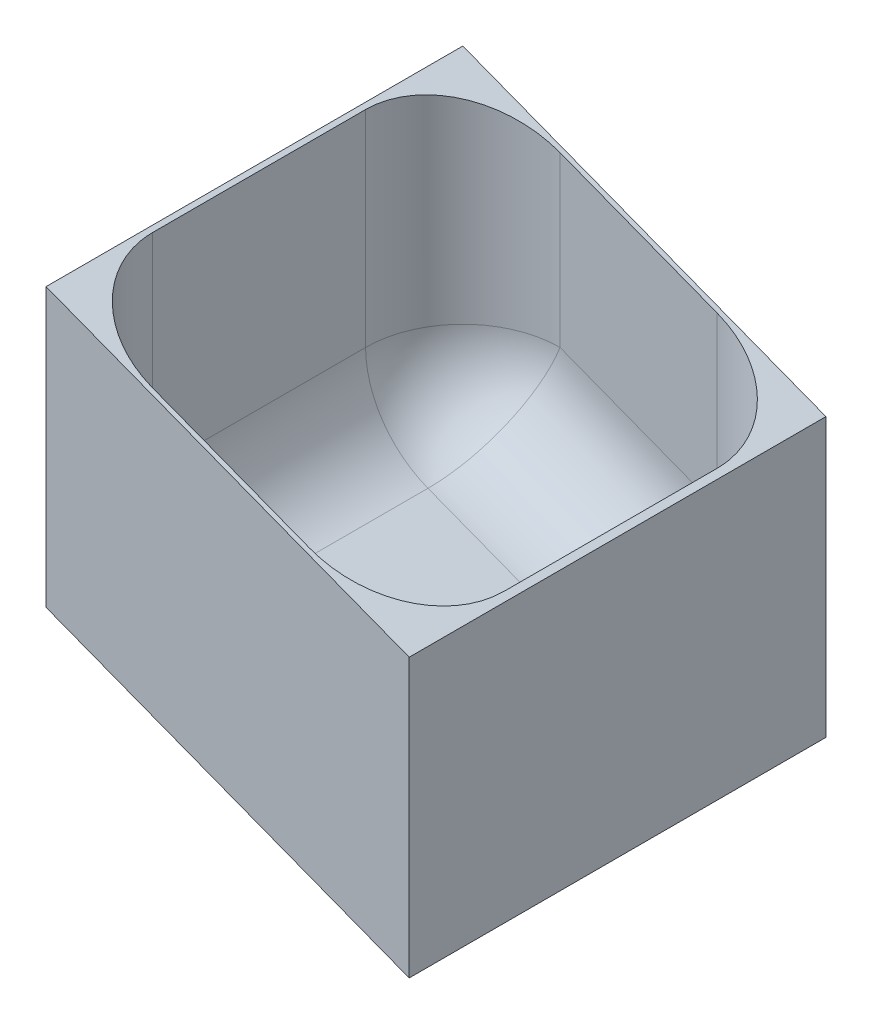
ISO-10303-21;
HEADER;
FILE_DESCRIPTION(('STEP AP214'),'2;1');
FILE_NAME('part.step','',(''),(''),'','','');
FILE_SCHEMA(('AUTOMOTIVE_DESIGN { 1 0 10303 214 1 1 1 1 }'));
ENDSEC;
DATA;
#1=APPLICATION_CONTEXT('core data for automotive mechanical design processes');
#2=APPLICATION_PROTOCOL_DEFINITION('international standard','automotive_design',2000,#1);
#3=PRODUCT_CONTEXT('',#1,'mechanical');
#4=PRODUCT('Part','Part','',(#3));
#5=PRODUCT_RELATED_PRODUCT_CATEGORY('part','',(#4));
#6=PRODUCT_DEFINITION_FORMATION('','',#4);
#7=PRODUCT_DEFINITION_CONTEXT('part definition',#1,'design');
#8=PRODUCT_DEFINITION('design','',#6,#7);
#9=PRODUCT_DEFINITION_SHAPE('','',#8);
#10=(LENGTH_UNIT() NAMED_UNIT(*) SI_UNIT(.MILLI.,.METRE.));
#11=(NAMED_UNIT(*) PLANE_ANGLE_UNIT() SI_UNIT($,.RADIAN.));
#12=(NAMED_UNIT(*) SI_UNIT($,.STERADIAN.) SOLID_ANGLE_UNIT());
#13=UNCERTAINTY_MEASURE_WITH_UNIT(LENGTH_MEASURE(1.E-05),#10,'distance_accuracy_value','');
#14=(GEOMETRIC_REPRESENTATION_CONTEXT(3) GLOBAL_UNCERTAINTY_ASSIGNED_CONTEXT((#13)) GLOBAL_UNIT_ASSIGNED_CONTEXT((#10,
#11,#12)) REPRESENTATION_CONTEXT('',''));
#15=CARTESIAN_POINT('',(0.,0.,0.));
#16=DIRECTION('',(0.,0.,1.));
#17=DIRECTION('',(1.,0.,0.));
#18=AXIS2_PLACEMENT_3D('',#15,#16,#17);
#19=CARTESIAN_POINT('',(33.1981199662404,-0.0871285716620917,38.1));
#20=DIRECTION('',(-0.358367949545305,-0.9335804264972,0.));
#21=DIRECTION('',(0.9335804264972,-0.358367949545305,0.));
#22=AXIS2_PLACEMENT_3D('',#19,#20,#21);
#23=PLANE('',#22);
#24=DIRECTION('',(-0.9335804264972,0.358367949545305,0.));
#25=VECTOR('',#24,1.);
#26=CARTESIAN_POINT('',(33.1981199662404,-0.0871285716620917,-38.1));
#27=LINE('',#26,#25);
#28=CARTESIAN_POINT('',(33.1981199662404,-0.0871285716620917,-38.1));
#29=VERTEX_POINT('',#28);
#30=CARTESIAN_POINT('',(-33.1981199662404,25.4,-38.1));
#31=VERTEX_POINT('',#30);
#32=EDGE_CURVE('E175',#29,#31,#27,.T.);
#33=ORIENTED_EDGE('',*,*,#32,.T.);
#34=DIRECTION('',(0.,0.,-1.));
#35=VECTOR('',#34,1.);
#36=CARTESIAN_POINT('',(-33.1981199662404,25.4,38.1));
#37=LINE('',#36,#35);
#38=CARTESIAN_POINT('',(-33.1981199662404,25.4,38.1));
#39=VERTEX_POINT('',#38);
#40=EDGE_CURVE('E153',#39,#31,#37,.T.);
#41=ORIENTED_EDGE('',*,*,#40,.F.);
#42=DIRECTION('',(-0.9335804264972,0.358367949545305,0.));
#43=VECTOR('',#42,1.);
#44=CARTESIAN_POINT('',(33.1981199662404,-0.0871285716620917,38.1));
#45=LINE('',#44,#43);
#46=CARTESIAN_POINT('',(33.1981199662404,-0.0871285716620917,38.1));
#47=VERTEX_POINT('',#46);
#48=EDGE_CURVE('E161',#47,#39,#45,.T.);
#49=ORIENTED_EDGE('',*,*,#48,.F.);
#50=DIRECTION('',(0.,0.,-1.));
#51=VECTOR('',#50,1.);
#52=CARTESIAN_POINT('',(33.1981199662404,-0.0871285716620917,38.1));
#53=LINE('',#52,#51);
#54=EDGE_CURVE('E303',#47,#29,#53,.T.);
#55=ORIENTED_EDGE('',*,*,#54,.T.);
#56=EDGE_LOOP('',(#33,#41,#49,#55));
#57=FACE_BOUND('',#56,.T.);
#58=DIRECTION('',(-0.9335804264972,0.358367949545305,0.));
#59=VECTOR('',#58,1.);
#60=CARTESIAN_POINT('',(33.1981199662404,-0.0871285716620917,-37.25333418));
#61=LINE('',#60,#59);
#62=CARTESIAN_POINT('',(14.1481199662404,7.22548129576269,-37.25333418));
#63=VERTEX_POINT('',#62);
#64=CARTESIAN_POINT('',(-14.5714541462404,18.2498928990784,-37.25333418));
#65=VERTEX_POINT('',#64);
#66=EDGE_CURVE('E284',#63,#65,#61,.T.);
#67=ORIENTED_EDGE('',*,*,#66,.F.);
#68=CARTESIAN_POINT('',(14.1481199662404,7.22548129576269,-19.47333418));
#69=DIRECTION('',(-0.358367949545305,-0.9335804264972,0.));
#70=DIRECTION('',(0.9335804264972,-0.358367949545305,0.));
#71=AXIS2_PLACEMENT_3D('',#68,#69,#70);
#72=ELLIPSE('',#71,19.0449579868664,17.78);
#73=CARTESIAN_POINT('',(31.9281199662404,0.400378752832894,-19.47333418));
#74=VERTEX_POINT('',#73);
#75=EDGE_CURVE('E231',#63,#74,#72,.T.);
#76=ORIENTED_EDGE('',*,*,#75,.T.);
#77=DIRECTION('',(0.,0.,-1.));
#78=VECTOR('',#77,1.);
#79=CARTESIAN_POINT('',(31.9281199662404,0.400378752832894,38.1));
#80=LINE('',#79,#78);
#81=CARTESIAN_POINT('',(31.9281199662404,0.400378752832894,19.47333418));
#82=VERTEX_POINT('',#81);
#83=EDGE_CURVE('E295',#82,#74,#80,.T.);
#84=ORIENTED_EDGE('',*,*,#83,.F.);
#85=CARTESIAN_POINT('',(14.1481199662404,7.22548129576269,19.47333418));
#86=DIRECTION('',(-0.358367949545305,-0.9335804264972,0.));
#87=DIRECTION('',(-0.9335804264972,0.358367949545305,0.));
#88=AXIS2_PLACEMENT_3D('',#85,#86,#87);
#89=ELLIPSE('',#88,19.0449579868664,17.78);
#90=CARTESIAN_POINT('',(14.1481199662404,7.22548129576269,37.25333418));
#91=VERTEX_POINT('',#90);
#92=EDGE_CURVE('E57',#82,#91,#89,.T.);
#93=ORIENTED_EDGE('',*,*,#92,.T.);
#94=DIRECTION('',(-0.9335804264972,0.358367949545305,0.));
#95=VECTOR('',#94,1.);
#96=CARTESIAN_POINT('',(33.1981199662404,-0.0871285716620917,37.25333418));
#97=LINE('',#96,#95);
#98=CARTESIAN_POINT('',(-14.5714541462404,18.2498928990784,37.25333418));
#99=VERTEX_POINT('',#98);
#100=EDGE_CURVE('E288',#91,#99,#97,.T.);
#101=ORIENTED_EDGE('',*,*,#100,.T.);
#102=CARTESIAN_POINT('',(-14.5714541462404,18.2498928990784,19.47333418));
#103=DIRECTION('',(-0.358367949545305,-0.9335804264972,0.));
#104=DIRECTION('',(0.9335804264972,-0.358367949545305,0.));
#105=AXIS2_PLACEMENT_3D('',#102,#103,#104);
#106=ELLIPSE('',#105,19.0449579868664,17.78);
#107=CARTESIAN_POINT('',(-32.3514541462404,25.0749954420082,19.47333418));
#108=VERTEX_POINT('',#107);
#109=EDGE_CURVE('E234',#99,#108,#106,.T.);
#110=ORIENTED_EDGE('',*,*,#109,.T.);
#111=DIRECTION('',(0.,0.,-1.));
#112=VECTOR('',#111,1.);
#113=CARTESIAN_POINT('',(-32.3514541462404,25.0749954420082,38.1));
#114=LINE('',#113,#112);
#115=CARTESIAN_POINT('',(-32.3514541462404,25.0749954420082,-19.47333418));
#116=VERTEX_POINT('',#115);
#117=EDGE_CURVE('E307',#108,#116,#114,.T.);
#118=ORIENTED_EDGE('',*,*,#117,.T.);
#119=CARTESIAN_POINT('',(-14.5714541462404,18.2498928990784,-19.47333418));
#120=DIRECTION('',(-0.358367949545305,-0.9335804264972,0.));
#121=DIRECTION('',(-0.9335804264972,0.358367949545305,0.));
#122=AXIS2_PLACEMENT_3D('',#119,#120,#121);
#123=ELLIPSE('',#122,19.0449579868664,17.78);
#124=EDGE_CURVE('E11',#116,#65,#123,.T.);
#125=ORIENTED_EDGE('',*,*,#124,.T.);
#126=EDGE_LOOP('',(#67,#76,#84,#93,#101,#110,#118,#125));
#127=FACE_BOUND('',#126,.T.);
#128=ADVANCED_FACE('F47',(#57,#127),#23,.F.);
#129=CARTESIAN_POINT('',(-33.1981199662404,25.4,38.1));
#130=DIRECTION('',(1.,0.,0.));
#131=DIRECTION('',(0.,1.,0.));
#132=AXIS2_PLACEMENT_3D('',#129,#130,#131);
#133=PLANE('',#132);
#134=DIRECTION('',(0.,-1.,0.));
#135=VECTOR('',#134,1.);
#136=CARTESIAN_POINT('',(-33.1981199662404,25.4,-38.1));
#137=LINE('',#136,#135);
#138=CARTESIAN_POINT('',(-33.1981199662404,-25.4,-38.1));
#139=VERTEX_POINT('',#138);
#140=EDGE_CURVE('E306',#31,#139,#137,.T.);
#141=ORIENTED_EDGE('',*,*,#140,.T.);
#142=DIRECTION('',(0.,0.,-1.));
#143=VECTOR('',#142,1.);
#144=CARTESIAN_POINT('',(-33.1981199662404,-25.4,38.1));
#145=LINE('',#144,#143);
#146=CARTESIAN_POINT('',(-33.1981199662404,-25.4,38.1));
#147=VERTEX_POINT('',#146);
#148=EDGE_CURVE('E156',#147,#139,#145,.T.);
#149=ORIENTED_EDGE('',*,*,#148,.F.);
#150=DIRECTION('',(0.,-1.,0.));
#151=VECTOR('',#150,1.);
#152=CARTESIAN_POINT('',(-33.1981199662404,25.4,38.1));
#153=LINE('',#152,#151);
#154=EDGE_CURVE('E149',#39,#147,#153,.T.);
#155=ORIENTED_EDGE('',*,*,#154,.F.);
#156=ORIENTED_EDGE('',*,*,#40,.T.);
#157=EDGE_LOOP('',(#141,#149,#155,#156));
#158=FACE_BOUND('',#157,.T.);
#159=ADVANCED_FACE('F151',(#158),#133,.F.);
#160=CARTESIAN_POINT('',(-33.1981199662404,-25.4,38.1));
#161=DIRECTION('',(0.358367949545305,0.9335804264972,0.));
#162=DIRECTION('',(-0.9335804264972,0.358367949545305,0.));
#163=AXIS2_PLACEMENT_3D('',#160,#161,#162);
#164=PLANE('',#163);
#165=DIRECTION('',(0.9335804264972,-0.358367949545305,0.));
#166=VECTOR('',#165,1.);
#167=CARTESIAN_POINT('',(-33.1981199662404,-25.4,-38.1));
#168=LINE('',#167,#166);
#169=CARTESIAN_POINT('',(33.1981199662404,-50.8871285716621,-38.1));
#170=VERTEX_POINT('',#169);
#171=EDGE_CURVE('E310',#139,#170,#168,.T.);
#172=ORIENTED_EDGE('',*,*,#171,.T.);
#173=DIRECTION('',(0.,0.,-1.));
#174=VECTOR('',#173,1.);
#175=CARTESIAN_POINT('',(33.1981199662404,-50.8871285716621,38.1));
#176=LINE('',#175,#174);
#177=CARTESIAN_POINT('',(33.1981199662404,-50.8871285716621,38.1));
#178=VERTEX_POINT('',#177);
#179=EDGE_CURVE('E183',#178,#170,#176,.T.);
#180=ORIENTED_EDGE('',*,*,#179,.F.);
#181=DIRECTION('',(0.9335804264972,-0.358367949545305,0.));
#182=VECTOR('',#181,1.);
#183=CARTESIAN_POINT('',(-33.1981199662404,-25.4,38.1));
#184=LINE('',#183,#182);
#185=EDGE_CURVE('E160',#147,#178,#184,.T.);
#186=ORIENTED_EDGE('',*,*,#185,.F.);
#187=ORIENTED_EDGE('',*,*,#148,.T.);
#188=EDGE_LOOP('',(#172,#180,#186,#187));
#189=FACE_BOUND('',#188,.T.);
#190=ADVANCED_FACE('F326',(#189),#164,.F.);
#191=CARTESIAN_POINT('',(33.1981199662404,-50.8871285716621,38.1));
#192=DIRECTION('',(-1.,0.,0.));
#193=DIRECTION('',(0.,-1.,0.));
#194=AXIS2_PLACEMENT_3D('',#191,#192,#193);
#195=PLANE('',#194);
#196=DIRECTION('',(0.,1.,0.));
#197=VECTOR('',#196,1.);
#198=CARTESIAN_POINT('',(33.1981199662404,-50.8871285716621,-38.1));
#199=LINE('',#198,#197);
#200=EDGE_CURVE('E171',#170,#29,#199,.T.);
#201=ORIENTED_EDGE('',*,*,#200,.T.);
#202=ORIENTED_EDGE('',*,*,#54,.F.);
#203=DIRECTION('',(0.,1.,0.));
#204=VECTOR('',#203,1.);
#205=CARTESIAN_POINT('',(33.1981199662404,-50.8871285716621,38.1));
#206=LINE('',#205,#204);
#207=EDGE_CURVE('E166',#178,#47,#206,.T.);
#208=ORIENTED_EDGE('',*,*,#207,.F.);
#209=ORIENTED_EDGE('',*,*,#179,.T.);
#210=EDGE_LOOP('',(#201,#202,#208,#209));
#211=FACE_BOUND('',#210,.T.);
#212=ADVANCED_FACE('F321',(#211),#195,.F.);
#213=CARTESIAN_POINT('',(0.,0.,38.1));
#214=DIRECTION('',(0.,0.,1.));
#215=DIRECTION('',(1.,0.,0.));
#216=AXIS2_PLACEMENT_3D('',#213,#214,#215);
#217=PLANE('',#216);
#218=ORIENTED_EDGE('',*,*,#48,.T.);
#219=ORIENTED_EDGE('',*,*,#154,.T.);
#220=ORIENTED_EDGE('',*,*,#185,.T.);
#221=ORIENTED_EDGE('',*,*,#207,.T.);
#222=EDGE_LOOP('',(#218,#219,#220,#221));
#223=FACE_BOUND('',#222,.T.);
#224=ADVANCED_FACE('F164',(#223),#217,.T.);
#225=CARTESIAN_POINT('',(0.,0.,-38.1));
#226=DIRECTION('',(0.,0.,1.));
#227=DIRECTION('',(1.,0.,0.));
#228=AXIS2_PLACEMENT_3D('',#225,#226,#227);
#229=PLANE('',#228);
#230=ORIENTED_EDGE('',*,*,#32,.F.);
#231=ORIENTED_EDGE('',*,*,#200,.F.);
#232=ORIENTED_EDGE('',*,*,#171,.F.);
#233=ORIENTED_EDGE('',*,*,#140,.F.);
#234=EDGE_LOOP('',(#230,#231,#232,#233));
#235=FACE_BOUND('',#234,.T.);
#236=ADVANCED_FACE('F325',(#235),#229,.F.);
#237=CARTESIAN_POINT('',(-32.3514541462404,25.4,38.1));
#238=DIRECTION('',(1.,0.,0.));
#239=DIRECTION('',(0.,1.,0.));
#240=AXIS2_PLACEMENT_3D('',#237,#238,#239);
#241=PLANE('',#240);
#242=ORIENTED_EDGE('',*,*,#117,.F.);
#243=DIRECTION('',(0.,-1.,0.));
#244=VECTOR('',#243,1.);
#245=CARTESIAN_POINT('',(-32.3514541462404,25.4,19.47333418));
#246=LINE('',#245,#244);
#247=CARTESIAN_POINT('',(-32.3514541462404,-12.5982472596786,19.47333418));
#248=VERTEX_POINT('',#247);
#249=EDGE_CURVE('E221',#108,#248,#246,.T.);
#250=ORIENTED_EDGE('',*,*,#249,.T.);
#251=DIRECTION('',(0.,0.,-1.));
#252=VECTOR('',#251,1.);
#253=CARTESIAN_POINT('',(-32.3514541462404,-12.5982472596786,-37.25333418));
#254=LINE('',#253,#252);
#255=CARTESIAN_POINT('',(-32.3514541462404,-12.5982472596786,-19.47333418));
#256=VERTEX_POINT('',#255);
#257=EDGE_CURVE('E218',#248,#256,#254,.T.);
#258=ORIENTED_EDGE('',*,*,#257,.T.);
#259=DIRECTION('',(0.,-1.,0.));
#260=VECTOR('',#259,1.);
#261=CARTESIAN_POINT('',(-32.3514541462404,25.0749954420082,-19.47333418));
#262=LINE('',#261,#260);
#263=EDGE_CURVE('E215',#256,#116,#262,.F.);
#264=ORIENTED_EDGE('',*,*,#263,.T.);
#265=EDGE_LOOP('',(#242,#250,#258,#264));
#266=FACE_BOUND('',#265,.T.);
#267=ADVANCED_FACE('F410',(#266),#241,.T.);
#268=CARTESIAN_POINT('',(-32.8947020723769,-24.6095693626638,38.1));
#269=DIRECTION('',(0.358367949545305,0.9335804264972,0.));
#270=DIRECTION('',(-0.9335804264972,0.358367949545305,0.));
#271=AXIS2_PLACEMENT_3D('',#268,#269,#270);
#272=PLANE('',#271);
#273=DIRECTION('',(0.9335804264972,-0.358367949545305,0.));
#274=VECTOR('',#273,1.);
#275=CARTESIAN_POINT('',(-32.8947020723769,-24.6095693626638,19.47333418));
#276=LINE('',#275,#274);
#277=CARTESIAN_POINT('',(-20.9432362891559,-29.1973072427988,19.47333418));
#278=VERTEX_POINT('',#277);
#279=CARTESIAN_POINT('',(7.77633782332491,-40.2217188461145,19.47333418));
#280=VERTEX_POINT('',#279);
#281=EDGE_CURVE('E196',#278,#280,#276,.T.);
#282=ORIENTED_EDGE('',*,*,#281,.T.);
#283=DIRECTION('',(0.,0.,-1.));
#284=VECTOR('',#283,1.);
#285=CARTESIAN_POINT('',(7.77633782332491,-40.2217188461145,-37.25333418));
#286=LINE('',#285,#284);
#287=CARTESIAN_POINT('',(7.77633782332491,-40.2217188461145,-19.47333418));
#288=VERTEX_POINT('',#287);
#289=EDGE_CURVE('E203',#280,#288,#286,.T.);
#290=ORIENTED_EDGE('',*,*,#289,.T.);
#291=DIRECTION('',(0.9335804264972,-0.358367949545305,0.));
#292=VECTOR('',#291,1.);
#293=CARTESIAN_POINT('',(-32.3514541462404,-24.8181027036152,-19.47333418));
#294=LINE('',#293,#292);
#295=CARTESIAN_POINT('',(-20.9432362891559,-29.1973072427988,-19.47333418));
#296=VERTEX_POINT('',#295);
#297=EDGE_CURVE('E199',#288,#296,#294,.F.);
#298=ORIENTED_EDGE('',*,*,#297,.T.);
#299=DIRECTION('',(0.,0.,-1.));
#300=VECTOR('',#299,1.);
#301=CARTESIAN_POINT('',(-20.9432362891559,-29.1973072427988,37.25333418));
#302=LINE('',#301,#300);
#303=EDGE_CURVE('E193',#296,#278,#302,.F.);
#304=ORIENTED_EDGE('',*,*,#303,.T.);
#305=EDGE_LOOP('',(#282,#290,#298,#304));
#306=FACE_BOUND('',#305,.T.);
#307=ADVANCED_FACE('F400',(#306),#272,.T.);
#308=CARTESIAN_POINT('',(31.9281199662404,-50.8871285716621,38.1));
#309=DIRECTION('',(-1.,0.,0.));
#310=DIRECTION('',(0.,-1.,0.));
#311=AXIS2_PLACEMENT_3D('',#308,#309,#310);
#312=PLANE('',#311);
#313=ORIENTED_EDGE('',*,*,#83,.T.);
#314=DIRECTION('',(0.,1.,0.));
#315=VECTOR('',#314,1.);
#316=CARTESIAN_POINT('',(31.9281199662404,-49.4927193927905,-19.47333418));
#317=LINE('',#316,#315);
#318=CARTESIAN_POINT('',(31.9281199662404,-23.6226588629943,-19.47333418));
#319=VERTEX_POINT('',#318);
#320=EDGE_CURVE('E212',#74,#319,#317,.F.);
#321=ORIENTED_EDGE('',*,*,#320,.T.);
#322=DIRECTION('',(0.,0.,-1.));
#323=VECTOR('',#322,1.);
#324=CARTESIAN_POINT('',(31.9281199662404,-23.6226588629943,37.25333418));
#325=LINE('',#324,#323);
#326=CARTESIAN_POINT('',(31.9281199662404,-23.6226588629943,19.47333418));
#327=VERTEX_POINT('',#326);
#328=EDGE_CURVE('E206',#319,#327,#325,.F.);
#329=ORIENTED_EDGE('',*,*,#328,.T.);
#330=DIRECTION('',(0.,1.,0.));
#331=VECTOR('',#330,1.);
#332=CARTESIAN_POINT('',(31.9281199662404,-50.8871285716621,19.47333418));
#333=LINE('',#332,#331);
#334=EDGE_CURVE('E209',#327,#82,#333,.T.);
#335=ORIENTED_EDGE('',*,*,#334,.T.);
#336=EDGE_LOOP('',(#313,#321,#329,#335));
#337=FACE_BOUND('',#336,.T.);
#338=ADVANCED_FACE('F421',(#337),#312,.T.);
#339=CARTESIAN_POINT('',(0.,0.,37.25333418));
#340=DIRECTION('',(0.,0.,1.));
#341=DIRECTION('',(1.,0.,0.));
#342=AXIS2_PLACEMENT_3D('',#339,#340,#341);
#343=PLANE('',#342);
#344=DIRECTION('',(0.9335804264972,-0.358367949545305,0.));
#345=VECTOR('',#344,1.);
#346=CARTESIAN_POINT('',(-6.08631311285423,-15.8553877345988,37.25333418));
#347=LINE('',#346,#345);
#348=CARTESIAN_POINT('',(14.1481199662404,-23.6226588629943,37.25333418));
#349=VERTEX_POINT('',#348);
#350=CARTESIAN_POINT('',(-14.5714541462404,-12.5982472596786,37.25333418));
#351=VERTEX_POINT('',#350);
#352=EDGE_CURVE('E65',#349,#351,#347,.F.);
#353=ORIENTED_EDGE('',*,*,#352,.T.);
#354=DIRECTION('',(0.,-1.,0.));
#355=VECTOR('',#354,1.);
#356=CARTESIAN_POINT('',(-14.5714541462404,0.,37.25333418));
#357=LINE('',#356,#355);
#358=EDGE_CURVE('E228',#351,#99,#357,.F.);
#359=ORIENTED_EDGE('',*,*,#358,.T.);
#360=ORIENTED_EDGE('',*,*,#100,.F.);
#361=DIRECTION('',(0.,1.,0.));
#362=VECTOR('',#361,1.);
#363=CARTESIAN_POINT('',(14.1481199662404,0.,37.25333418));
#364=LINE('',#363,#362);
#365=EDGE_CURVE('E70',#91,#349,#364,.F.);
#366=ORIENTED_EDGE('',*,*,#365,.T.);
#367=EDGE_LOOP('',(#353,#359,#360,#366));
#368=FACE_BOUND('',#367,.T.);
#369=ADVANCED_FACE('F394',(#368),#343,.F.);
#370=CARTESIAN_POINT('',(0.,0.,-37.25333418));
#371=DIRECTION('',(0.,0.,1.));
#372=DIRECTION('',(1.,0.,0.));
#373=AXIS2_PLACEMENT_3D('',#370,#371,#372);
#374=PLANE('',#373);
#375=DIRECTION('',(0.9335804264972,-0.358367949545305,0.));
#376=VECTOR('',#375,1.);
#377=CARTESIAN_POINT('',(38.299902109156,-32.8936594096703,-37.25333418));
#378=LINE('',#377,#376);
#379=CARTESIAN_POINT('',(-14.5714541462404,-12.5982472596786,-37.25333418));
#380=VERTEX_POINT('',#379);
#381=CARTESIAN_POINT('',(14.1481199662404,-23.6226588629943,-37.25333418));
#382=VERTEX_POINT('',#381);
#383=EDGE_CURVE('E181',#380,#382,#378,.T.);
#384=ORIENTED_EDGE('',*,*,#383,.T.);
#385=DIRECTION('',(0.,1.,0.));
#386=VECTOR('',#385,1.);
#387=CARTESIAN_POINT('',(14.1481199662404,0.400378752832896,-37.25333418));
#388=LINE('',#387,#386);
#389=EDGE_CURVE('E190',#382,#63,#388,.T.);
#390=ORIENTED_EDGE('',*,*,#389,.T.);
#391=ORIENTED_EDGE('',*,*,#66,.T.);
#392=DIRECTION('',(0.,-1.,0.));
#393=VECTOR('',#392,1.);
#394=CARTESIAN_POINT('',(-14.5714541462404,-24.8181027036152,-37.25333418));
#395=LINE('',#394,#393);
#396=EDGE_CURVE('E177',#65,#380,#395,.T.);
#397=ORIENTED_EDGE('',*,*,#396,.T.);
#398=EDGE_LOOP('',(#384,#390,#391,#397));
#399=FACE_BOUND('',#398,.T.);
#400=ADVANCED_FACE('F386',(#399),#374,.T.);
#401=CARTESIAN_POINT('',(-14.5714541462404,25.4,19.47333418));
#402=DIRECTION('',(0.,-1.,0.));
#403=DIRECTION('',(1.,0.,0.));
#404=AXIS2_PLACEMENT_3D('',#401,#402,#403);
#405=CYLINDRICAL_SURFACE('',#404,17.78);
#406=ORIENTED_EDGE('',*,*,#109,.F.);
#407=ORIENTED_EDGE('',*,*,#358,.F.);
#408=CARTESIAN_POINT('',(-14.5714541462404,-12.5982472596786,19.47333418));
#409=DIRECTION('',(0.,1.,0.));
#410=DIRECTION('',(0.,0.,1.));
#411=AXIS2_PLACEMENT_3D('',#408,#409,#410);
#412=CIRCLE('',#411,17.78);
#413=EDGE_CURVE('E276',#248,#351,#412,.T.);
#414=ORIENTED_EDGE('',*,*,#413,.F.);
#415=ORIENTED_EDGE('',*,*,#249,.F.);
#416=EDGE_LOOP('',(#406,#407,#414,#415));
#417=FACE_BOUND('',#416,.T.);
#418=ADVANCED_FACE('F49',(#417),#405,.F.);
#419=CARTESIAN_POINT('',(14.1481199662404,-50.8871285716621,19.47333418));
#420=DIRECTION('',(0.,1.,0.));
#421=DIRECTION('',(-1.,0.,0.));
#422=AXIS2_PLACEMENT_3D('',#419,#420,#421);
#423=CYLINDRICAL_SURFACE('',#422,17.78);
#424=ORIENTED_EDGE('',*,*,#92,.F.);
#425=ORIENTED_EDGE('',*,*,#334,.F.);
#426=CARTESIAN_POINT('',(14.1481199662404,-23.6226588629943,19.47333418));
#427=DIRECTION('',(0.,1.,0.));
#428=DIRECTION('',(-1.,0.,0.));
#429=AXIS2_PLACEMENT_3D('',#426,#427,#428);
#430=CIRCLE('',#429,17.78);
#431=EDGE_CURVE('E273',#349,#327,#430,.T.);
#432=ORIENTED_EDGE('',*,*,#431,.F.);
#433=ORIENTED_EDGE('',*,*,#365,.F.);
#434=EDGE_LOOP('',(#424,#425,#432,#433));
#435=FACE_BOUND('',#434,.T.);
#436=ADVANCED_FACE('F379',(#435),#423,.F.);
#437=CARTESIAN_POINT('',(-26.5229199294614,-8.01050937954358,19.47333418));
#438=DIRECTION('',(0.9335804264972,-0.358367949545305,0.));
#439=DIRECTION('',(0.358367949545305,0.9335804264972,0.));
#440=AXIS2_PLACEMENT_3D('',#437,#438,#439);
#441=CYLINDRICAL_SURFACE('',#440,17.78);
#442=CARTESIAN_POINT('',(-14.5714541462404,-12.5982472596786,19.47333418));
#443=DIRECTION('',(0.9335804264972,-0.358367949545305,0.));
#444=DIRECTION('',(0.358367949545305,0.9335804264972,0.));
#445=AXIS2_PLACEMENT_3D('',#442,#443,#444);
#446=CIRCLE('',#445,17.78);
#447=EDGE_CURVE('E51',#351,#278,#446,.T.);
#448=ORIENTED_EDGE('',*,*,#447,.F.);
#449=ORIENTED_EDGE('',*,*,#352,.F.);
#450=CARTESIAN_POINT('',(14.1481199662404,-23.6226588629943,19.47333418));
#451=DIRECTION('',(-0.9335804264972,0.358367949545305,0.));
#452=DIRECTION('',(-0.358367949545305,-0.9335804264972,0.));
#453=AXIS2_PLACEMENT_3D('',#450,#451,#452);
#454=CIRCLE('',#453,17.78);
#455=EDGE_CURVE('E269',#280,#349,#454,.T.);
#456=ORIENTED_EDGE('',*,*,#455,.F.);
#457=ORIENTED_EDGE('',*,*,#281,.F.);
#458=EDGE_LOOP('',(#448,#449,#456,#457));
#459=FACE_BOUND('',#458,.T.);
#460=ADVANCED_FACE('F377',(#459),#441,.F.);
#461=CARTESIAN_POINT('',(-14.5714541462404,-12.5982472596786,19.47333418));
#462=DIRECTION('',(0.,0.,1.));
#463=DIRECTION('',(0.,-1.,0.));
#464=AXIS2_PLACEMENT_3D('',#461,#462,#463);
#465=SPHERICAL_SURFACE('',#464,17.78);
#466=ORIENTED_EDGE('',*,*,#413,.T.);
#467=ORIENTED_EDGE('',*,*,#447,.T.);
#468=CARTESIAN_POINT('',(-14.5714541462404,-12.5982472596786,19.47333418));
#469=DIRECTION('',(0.,0.,-1.));
#470=DIRECTION('',(-1.,0.,0.));
#471=AXIS2_PLACEMENT_3D('',#468,#469,#470);
#472=CIRCLE('',#471,17.78);
#473=EDGE_CURVE('E265',#248,#278,#472,.F.);
#474=ORIENTED_EDGE('',*,*,#473,.F.);
#475=EDGE_LOOP('',(#466,#467,#474));
#476=FACE_BOUND('',#475,.T.);
#477=ADVANCED_FACE('F373',(#476),#465,.F.);
#478=CARTESIAN_POINT('',(14.1481199662404,-23.6226588629943,19.47333418));
#479=DIRECTION('',(0.,0.,1.));
#480=DIRECTION('',(1.,0.,0.));
#481=AXIS2_PLACEMENT_3D('',#478,#479,#480);
#482=SPHERICAL_SURFACE('',#481,17.78);
#483=ORIENTED_EDGE('',*,*,#455,.T.);
#484=ORIENTED_EDGE('',*,*,#431,.T.);
#485=CARTESIAN_POINT('',(14.1481199662404,-23.6226588629943,19.47333418));
#486=DIRECTION('',(0.,0.,-1.));
#487=DIRECTION('',(-1.,0.,0.));
#488=AXIS2_PLACEMENT_3D('',#485,#486,#487);
#489=CIRCLE('',#488,17.78);
#490=EDGE_CURVE('E261',#280,#327,#489,.F.);
#491=ORIENTED_EDGE('',*,*,#490,.F.);
#492=EDGE_LOOP('',(#483,#484,#491));
#493=FACE_BOUND('',#492,.T.);
#494=ADVANCED_FACE('F369',(#493),#482,.F.);
#495=CARTESIAN_POINT('',(-14.5714541462404,-12.5982472596786,38.1));
#496=DIRECTION('',(0.,0.,1.));
#497=DIRECTION('',(1.,0.,0.));
#498=AXIS2_PLACEMENT_3D('',#495,#496,#497);
#499=CYLINDRICAL_SURFACE('',#498,17.78);
#500=ORIENTED_EDGE('',*,*,#473,.T.);
#501=ORIENTED_EDGE('',*,*,#303,.F.);
#502=CARTESIAN_POINT('',(-14.5714541462404,-12.5982472596786,-19.47333418));
#503=DIRECTION('',(0.,0.,1.));
#504=DIRECTION('',(1.,0.,0.));
#505=AXIS2_PLACEMENT_3D('',#502,#503,#504);
#506=CIRCLE('',#505,17.78);
#507=EDGE_CURVE('E257',#256,#296,#506,.T.);
#508=ORIENTED_EDGE('',*,*,#507,.F.);
#509=ORIENTED_EDGE('',*,*,#257,.F.);
#510=EDGE_LOOP('',(#500,#501,#508,#509));
#511=FACE_BOUND('',#510,.T.);
#512=ADVANCED_FACE('F365',(#511),#499,.F.);
#513=CARTESIAN_POINT('',(-14.5714541462404,0.,-19.47333418));
#514=DIRECTION('',(0.,1.,0.));
#515=DIRECTION('',(-1.,0.,0.));
#516=AXIS2_PLACEMENT_3D('',#513,#514,#515);
#517=CYLINDRICAL_SURFACE('',#516,17.78);
#518=ORIENTED_EDGE('',*,*,#124,.F.);
#519=ORIENTED_EDGE('',*,*,#263,.F.);
#520=CARTESIAN_POINT('',(-14.5714541462404,-12.5982472596786,-19.47333418));
#521=DIRECTION('',(0.,1.,0.));
#522=DIRECTION('',(-1.,0.,0.));
#523=AXIS2_PLACEMENT_3D('',#520,#521,#522);
#524=CIRCLE('',#523,17.78);
#525=EDGE_CURVE('E253',#380,#256,#524,.T.);
#526=ORIENTED_EDGE('',*,*,#525,.F.);
#527=ORIENTED_EDGE('',*,*,#396,.F.);
#528=EDGE_LOOP('',(#518,#519,#526,#527));
#529=FACE_BOUND('',#528,.T.);
#530=ADVANCED_FACE('F361',(#529),#517,.F.);
#531=CARTESIAN_POINT('',(14.1481199662404,0.,-19.47333418));
#532=DIRECTION('',(0.,-1.,0.));
#533=DIRECTION('',(1.,0.,0.));
#534=AXIS2_PLACEMENT_3D('',#531,#532,#533);
#535=CYLINDRICAL_SURFACE('',#534,17.78);
#536=ORIENTED_EDGE('',*,*,#75,.F.);
#537=ORIENTED_EDGE('',*,*,#389,.F.);
#538=CARTESIAN_POINT('',(14.1481199662404,-23.6226588629943,-19.47333418));
#539=DIRECTION('',(0.,1.,0.));
#540=DIRECTION('',(0.,0.,1.));
#541=AXIS2_PLACEMENT_3D('',#538,#539,#540);
#542=CIRCLE('',#541,17.78);
#543=EDGE_CURVE('E249',#319,#382,#542,.T.);
#544=ORIENTED_EDGE('',*,*,#543,.F.);
#545=ORIENTED_EDGE('',*,*,#320,.F.);
#546=EDGE_LOOP('',(#536,#537,#544,#545));
#547=FACE_BOUND('',#546,.T.);
#548=ADVANCED_FACE('F357',(#547),#535,.F.);
#549=CARTESIAN_POINT('',(14.1481199662404,-23.6226588629943,38.1));
#550=DIRECTION('',(0.,0.,1.));
#551=DIRECTION('',(1.,0.,0.));
#552=AXIS2_PLACEMENT_3D('',#549,#550,#551);
#553=CYLINDRICAL_SURFACE('',#552,17.78);
#554=ORIENTED_EDGE('',*,*,#490,.T.);
#555=ORIENTED_EDGE('',*,*,#328,.F.);
#556=CARTESIAN_POINT('',(14.1481199662404,-23.6226588629943,-19.47333418));
#557=DIRECTION('',(0.,0.,1.));
#558=DIRECTION('',(1.,0.,0.));
#559=AXIS2_PLACEMENT_3D('',#556,#557,#558);
#560=CIRCLE('',#559,17.78);
#561=EDGE_CURVE('E245',#288,#319,#560,.T.);
#562=ORIENTED_EDGE('',*,*,#561,.F.);
#563=ORIENTED_EDGE('',*,*,#289,.F.);
#564=EDGE_LOOP('',(#554,#555,#562,#563));
#565=FACE_BOUND('',#564,.T.);
#566=ADVANCED_FACE('F353',(#565),#553,.F.);
#567=CARTESIAN_POINT('',(-14.5714541462404,-12.5982472596786,-19.47333418));
#568=DIRECTION('',(0.,0.,-1.));
#569=DIRECTION('',(-1.,0.,0.));
#570=AXIS2_PLACEMENT_3D('',#567,#568,#569);
#571=SPHERICAL_SURFACE('',#570,17.78);
#572=ORIENTED_EDGE('',*,*,#525,.T.);
#573=ORIENTED_EDGE('',*,*,#507,.T.);
#574=CARTESIAN_POINT('',(-14.5714541462404,-12.5982472596786,-19.47333418));
#575=DIRECTION('',(0.9335804264972,-0.358367949545305,0.));
#576=DIRECTION('',(0.358367949545305,0.9335804264972,0.));
#577=AXIS2_PLACEMENT_3D('',#574,#575,#576);
#578=CIRCLE('',#577,17.78);
#579=EDGE_CURVE('E242',#380,#296,#578,.F.);
#580=ORIENTED_EDGE('',*,*,#579,.F.);
#581=EDGE_LOOP('',(#572,#573,#580));
#582=FACE_BOUND('',#581,.T.);
#583=ADVANCED_FACE('F349',(#582),#571,.F.);
#584=CARTESIAN_POINT('',(14.1481199662404,-23.6226588629943,-19.47333418));
#585=DIRECTION('',(0.,0.,-1.));
#586=DIRECTION('',(0.,1.,0.));
#587=AXIS2_PLACEMENT_3D('',#584,#585,#586);
#588=SPHERICAL_SURFACE('',#587,17.78);
#589=ORIENTED_EDGE('',*,*,#561,.T.);
#590=ORIENTED_EDGE('',*,*,#543,.T.);
#591=CARTESIAN_POINT('',(14.1481199662404,-23.6226588629943,-19.47333418));
#592=DIRECTION('',(-0.9335804264972,0.358367949545304,0.));
#593=DIRECTION('',(-0.358367949545304,-0.9335804264972,0.));
#594=AXIS2_PLACEMENT_3D('',#591,#592,#593);
#595=CIRCLE('',#594,17.78);
#596=EDGE_CURVE('E239',#288,#382,#595,.F.);
#597=ORIENTED_EDGE('',*,*,#596,.F.);
#598=EDGE_LOOP('',(#589,#590,#597));
#599=FACE_BOUND('',#598,.T.);
#600=ADVANCED_FACE('F345',(#599),#588,.F.);
#601=CARTESIAN_POINT('',(-6.08631311285423,-15.8553877345988,-19.47333418));
#602=DIRECTION('',(-0.9335804264972,0.358367949545305,0.));
#603=DIRECTION('',(-0.358367949545305,-0.9335804264972,0.));
#604=AXIS2_PLACEMENT_3D('',#601,#602,#603);
#605=CYLINDRICAL_SURFACE('',#604,17.78);
#606=ORIENTED_EDGE('',*,*,#579,.T.);
#607=ORIENTED_EDGE('',*,*,#297,.F.);
#608=ORIENTED_EDGE('',*,*,#596,.T.);
#609=ORIENTED_EDGE('',*,*,#383,.F.);
#610=EDGE_LOOP('',(#606,#607,#608,#609));
#611=FACE_BOUND('',#610,.T.);
#612=ADVANCED_FACE('F342',(#611),#605,.F.);
#613=CLOSED_SHELL('',(#128,#159,#190,#212,#224,#236,#267,#307,#338,#369,#400,#418,#436,#460,
#477,#494,#512,#530,#548,#566,#583,#600,#612));
#614=MANIFOLD_SOLID_BREP('B2',#613);
#615=ADVANCED_BREP_SHAPE_REPRESENTATION('',(#18,#614),#14);
#616=SHAPE_DEFINITION_REPRESENTATION(#9,#615);
ENDSEC;
END-ISO-10303-21;
